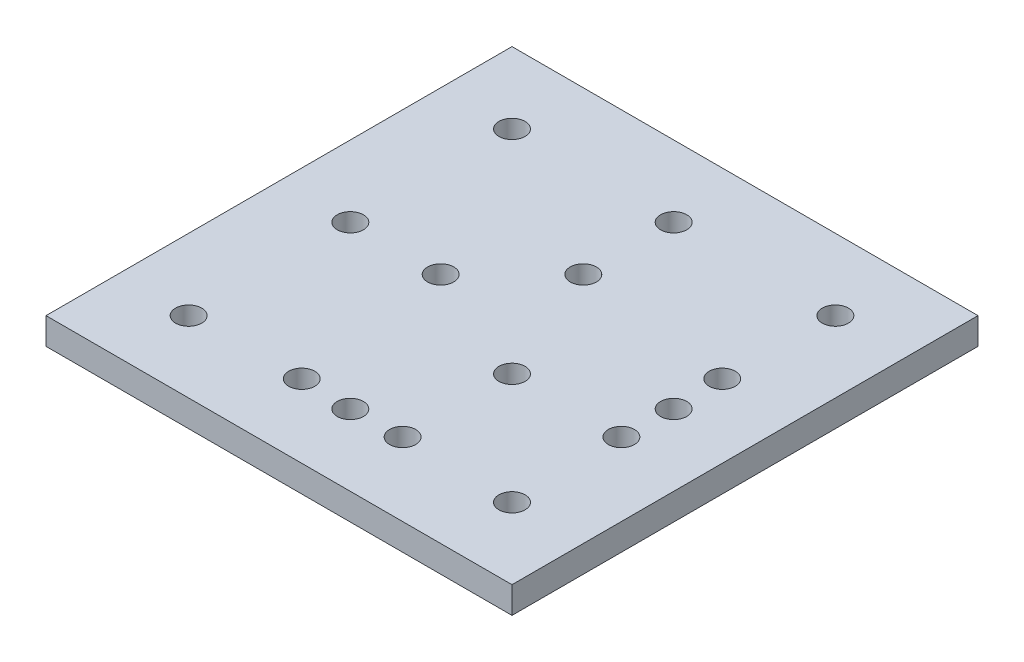
ISO-10303-21;
HEADER;
FILE_DESCRIPTION(('STEP AP214'),'2;1');
FILE_NAME('part.step','',(''),(''),'','','');
FILE_SCHEMA(('AUTOMOTIVE_DESIGN { 1 0 10303 214 1 1 1 1 }'));
ENDSEC;
DATA;
#1=APPLICATION_CONTEXT('core data for automotive mechanical design processes');
#2=APPLICATION_PROTOCOL_DEFINITION('international standard','automotive_design',2000,#1);
#3=PRODUCT_CONTEXT('',#1,'mechanical');
#4=PRODUCT('Part','Part','',(#3));
#5=PRODUCT_RELATED_PRODUCT_CATEGORY('part','',(#4));
#6=PRODUCT_DEFINITION_FORMATION('','',#4);
#7=PRODUCT_DEFINITION_CONTEXT('part definition',#1,'design');
#8=PRODUCT_DEFINITION('design','',#6,#7);
#9=PRODUCT_DEFINITION_SHAPE('','',#8);
#10=(LENGTH_UNIT() NAMED_UNIT(*) SI_UNIT(.MILLI.,.METRE.));
#11=(NAMED_UNIT(*) PLANE_ANGLE_UNIT() SI_UNIT($,.RADIAN.));
#12=(NAMED_UNIT(*) SI_UNIT($,.STERADIAN.) SOLID_ANGLE_UNIT());
#13=UNCERTAINTY_MEASURE_WITH_UNIT(LENGTH_MEASURE(1.E-05),#10,'distance_accuracy_value','');
#14=(GEOMETRIC_REPRESENTATION_CONTEXT(3) GLOBAL_UNCERTAINTY_ASSIGNED_CONTEXT((#13)) GLOBAL_UNIT_ASSIGNED_CONTEXT((#10,
#11,#12)) REPRESENTATION_CONTEXT('',''));
#15=CARTESIAN_POINT('',(0.,0.,0.));
#16=DIRECTION('',(0.,0.,1.));
#17=DIRECTION('',(1.,0.,0.));
#18=AXIS2_PLACEMENT_3D('',#15,#16,#17);
#19=CARTESIAN_POINT('',(0.,11.2,0.));
#20=DIRECTION('',(0.,1.,0.));
#21=DIRECTION('',(0.,0.,1.));
#22=AXIS2_PLACEMENT_3D('',#19,#20,#21);
#23=PLANE('',#22);
#24=CARTESIAN_POINT('',(82.6066017177982,11.2,-59.6066017177982));
#25=DIRECTION('',(0.,1.,0.));
#26=DIRECTION('',(0.,0.,1.));
#27=AXIS2_PLACEMENT_3D('',#24,#25,#26);
#28=CIRCLE('',#27,2.75000000000001);
#29=CARTESIAN_POINT('',(82.6066017177982,11.2,-56.8566017177982));
#30=VERTEX_POINT('',#29);
#31=EDGE_CURVE('E195',#30,#30,#28,.T.);
#32=ORIENTED_EDGE('',*,*,#31,.F.);
#33=EDGE_LOOP('',(#32));
#34=FACE_BOUND('',#33,.T.);
#35=CARTESIAN_POINT('',(82.6066017177982,11.2,-38.3933982822018));
#36=DIRECTION('',(0.,1.,0.));
#37=DIRECTION('',(0.,0.,1.));
#38=AXIS2_PLACEMENT_3D('',#35,#36,#37);
#39=CIRCLE('',#38,2.75000000000001);
#40=CARTESIAN_POINT('',(82.6066017177982,11.2,-35.6433982822018));
#41=VERTEX_POINT('',#40);
#42=EDGE_CURVE('E189',#41,#41,#39,.T.);
#43=ORIENTED_EDGE('',*,*,#42,.F.);
#44=EDGE_LOOP('',(#43));
#45=FACE_BOUND('',#44,.T.);
#46=CARTESIAN_POINT('',(34.,11.2,-49.));
#47=DIRECTION('',(0.,1.,0.));
#48=DIRECTION('',(0.,0.,1.));
#49=AXIS2_PLACEMENT_3D('',#46,#47,#48);
#50=CIRCLE('',#49,2.75);
#51=CARTESIAN_POINT('',(34.,11.2,-46.25));
#52=VERTEX_POINT('',#51);
#53=EDGE_CURVE('E183',#52,#52,#50,.T.);
#54=ORIENTED_EDGE('',*,*,#53,.F.);
#55=EDGE_LOOP('',(#54));
#56=FACE_BOUND('',#55,.T.);
#57=CARTESIAN_POINT('',(38.3933982822018,11.2,-15.3933982822018));
#58=DIRECTION('',(0.,1.,0.));
#59=DIRECTION('',(0.,0.,1.));
#60=AXIS2_PLACEMENT_3D('',#57,#58,#59);
#61=CIRCLE('',#60,2.75);
#62=CARTESIAN_POINT('',(38.3933982822018,11.2,-12.6433982822018));
#63=VERTEX_POINT('',#62);
#64=EDGE_CURVE('E177',#63,#63,#61,.T.);
#65=ORIENTED_EDGE('',*,*,#64,.F.);
#66=EDGE_LOOP('',(#65));
#67=FACE_BOUND('',#66,.T.);
#68=CARTESIAN_POINT('',(59.6066017177982,11.2,-15.3933982822018));
#69=DIRECTION('',(0.,1.,0.));
#70=DIRECTION('',(0.,0.,1.));
#71=AXIS2_PLACEMENT_3D('',#68,#69,#70);
#72=CIRCLE('',#71,2.75);
#73=CARTESIAN_POINT('',(59.6066017177982,11.2,-12.6433982822018));
#74=VERTEX_POINT('',#73);
#75=EDGE_CURVE('E171',#74,#74,#72,.T.);
#76=ORIENTED_EDGE('',*,*,#75,.F.);
#77=EDGE_LOOP('',(#76));
#78=FACE_BOUND('',#77,.T.);
#79=CARTESIAN_POINT('',(59.6066017177982,11.2,-38.3933982822018));
#80=DIRECTION('',(0.,1.,0.));
#81=DIRECTION('',(0.,0.,1.));
#82=AXIS2_PLACEMENT_3D('',#79,#80,#81);
#83=CIRCLE('',#82,2.75);
#84=CARTESIAN_POINT('',(59.6066017177982,11.2,-35.6433982822018));
#85=VERTEX_POINT('',#84);
#86=EDGE_CURVE('E165',#85,#85,#83,.T.);
#87=ORIENTED_EDGE('',*,*,#86,.F.);
#88=EDGE_LOOP('',(#87));
#89=FACE_BOUND('',#88,.T.);
#90=CARTESIAN_POINT('',(49.,11.2,-64.));
#91=DIRECTION('',(0.,1.,0.));
#92=DIRECTION('',(0.,0.,1.));
#93=AXIS2_PLACEMENT_3D('',#90,#91,#92);
#94=CIRCLE('',#93,2.75);
#95=CARTESIAN_POINT('',(49.,11.2,-61.25));
#96=VERTEX_POINT('',#95);
#97=EDGE_CURVE('E159',#96,#96,#94,.T.);
#98=ORIENTED_EDGE('',*,*,#97,.F.);
#99=EDGE_LOOP('',(#98));
#100=FACE_BOUND('',#99,.T.);
#101=CARTESIAN_POINT('',(15.,11.2,-83.));
#102=DIRECTION('',(0.,1.,0.));
#103=DIRECTION('',(0.,0.,1.));
#104=AXIS2_PLACEMENT_3D('',#101,#102,#103);
#105=CIRCLE('',#104,2.75);
#106=CARTESIAN_POINT('',(15.,11.2,-80.25));
#107=VERTEX_POINT('',#106);
#108=EDGE_CURVE('E144',#107,#107,#105,.T.);
#109=ORIENTED_EDGE('',*,*,#108,.F.);
#110=EDGE_LOOP('',(#109));
#111=FACE_BOUND('',#110,.T.);
#112=CARTESIAN_POINT('',(83.,11.2,-83.));
#113=DIRECTION('',(0.,1.,0.));
#114=DIRECTION('',(0.,0.,1.));
#115=AXIS2_PLACEMENT_3D('',#112,#113,#114);
#116=CIRCLE('',#115,2.75000000000001);
#117=CARTESIAN_POINT('',(83.,11.2,-80.25));
#118=VERTEX_POINT('',#117);
#119=EDGE_CURVE('E132',#118,#118,#116,.T.);
#120=ORIENTED_EDGE('',*,*,#119,.F.);
#121=EDGE_LOOP('',(#120));
#122=FACE_BOUND('',#121,.T.);
#123=CARTESIAN_POINT('',(83.0000000000007,11.2,-15.));
#124=DIRECTION('',(0.,1.,0.));
#125=DIRECTION('',(0.,0.,1.));
#126=AXIS2_PLACEMENT_3D('',#123,#124,#125);
#127=CIRCLE('',#126,2.75000000000001);
#128=CARTESIAN_POINT('',(83.0000000000007,11.2,-12.25));
#129=VERTEX_POINT('',#128);
#130=EDGE_CURVE('E120',#129,#129,#127,.T.);
#131=ORIENTED_EDGE('',*,*,#130,.F.);
#132=EDGE_LOOP('',(#131));
#133=FACE_BOUND('',#132,.T.);
#134=CARTESIAN_POINT('',(15.0000000000007,11.2,-15.));
#135=DIRECTION('',(0.,1.,0.));
#136=DIRECTION('',(0.,0.,1.));
#137=AXIS2_PLACEMENT_3D('',#134,#135,#136);
#138=CIRCLE('',#137,2.75);
#139=CARTESIAN_POINT('',(15.0000000000007,11.2,-12.25));
#140=VERTEX_POINT('',#139);
#141=EDGE_CURVE('E99',#140,#140,#138,.T.);
#142=ORIENTED_EDGE('',*,*,#141,.F.);
#143=EDGE_LOOP('',(#142));
#144=FACE_BOUND('',#143,.T.);
#145=DIRECTION('',(-1.,0.,0.));
#146=VECTOR('',#145,1.);
#147=CARTESIAN_POINT('',(98.,11.2,-98.));
#148=LINE('',#147,#146);
#149=CARTESIAN_POINT('',(98.,11.2,-98.));
#150=VERTEX_POINT('',#149);
#151=CARTESIAN_POINT('',(0.,11.2,-98.));
#152=VERTEX_POINT('',#151);
#153=EDGE_CURVE('E84',#150,#152,#148,.T.);
#154=ORIENTED_EDGE('',*,*,#153,.T.);
#155=DIRECTION('',(0.,0.,1.));
#156=VECTOR('',#155,1.);
#157=CARTESIAN_POINT('',(0.,11.2,-98.));
#158=LINE('',#157,#156);
#159=CARTESIAN_POINT('',(0.,11.2,0.));
#160=VERTEX_POINT('',#159);
#161=EDGE_CURVE('E79',#152,#160,#158,.T.);
#162=ORIENTED_EDGE('',*,*,#161,.T.);
#163=DIRECTION('',(1.,0.,0.));
#164=VECTOR('',#163,1.);
#165=CARTESIAN_POINT('',(0.,11.2,0.));
#166=LINE('',#165,#164);
#167=CARTESIAN_POINT('',(98.,11.2,0.));
#168=VERTEX_POINT('',#167);
#169=EDGE_CURVE('E82',#160,#168,#166,.T.);
#170=ORIENTED_EDGE('',*,*,#169,.T.);
#171=DIRECTION('',(0.,0.,-1.));
#172=VECTOR('',#171,1.);
#173=CARTESIAN_POINT('',(98.,11.2,0.));
#174=LINE('',#173,#172);
#175=EDGE_CURVE('E49',#168,#150,#174,.T.);
#176=ORIENTED_EDGE('',*,*,#175,.T.);
#177=EDGE_LOOP('',(#154,#162,#170,#176));
#178=FACE_BOUND('',#177,.T.);
#179=CARTESIAN_POINT('',(49.0000000000007,11.2,-15.));
#180=DIRECTION('',(0.,1.,0.));
#181=DIRECTION('',(0.,0.,1.));
#182=AXIS2_PLACEMENT_3D('',#179,#180,#181);
#183=CIRCLE('',#182,2.75);
#184=CARTESIAN_POINT('',(49.0000000000007,11.2,-12.25));
#185=VERTEX_POINT('',#184);
#186=EDGE_CURVE('E114',#185,#185,#183,.T.);
#187=ORIENTED_EDGE('',*,*,#186,.F.);
#188=EDGE_LOOP('',(#187));
#189=FACE_BOUND('',#188,.T.);
#190=CARTESIAN_POINT('',(83.0000000000004,11.2,-49.));
#191=DIRECTION('',(0.,1.,0.));
#192=DIRECTION('',(0.,0.,1.));
#193=AXIS2_PLACEMENT_3D('',#190,#191,#192);
#194=CIRCLE('',#193,2.75000000000001);
#195=CARTESIAN_POINT('',(83.0000000000004,11.2,-46.25));
#196=VERTEX_POINT('',#195);
#197=EDGE_CURVE('E126',#196,#196,#194,.T.);
#198=ORIENTED_EDGE('',*,*,#197,.F.);
#199=EDGE_LOOP('',(#198));
#200=FACE_BOUND('',#199,.T.);
#201=CARTESIAN_POINT('',(49.,11.2,-83.));
#202=DIRECTION('',(0.,1.,0.));
#203=DIRECTION('',(0.,0.,1.));
#204=AXIS2_PLACEMENT_3D('',#201,#202,#203);
#205=CIRCLE('',#204,2.75);
#206=CARTESIAN_POINT('',(49.,11.2,-80.25));
#207=VERTEX_POINT('',#206);
#208=EDGE_CURVE('E138',#207,#207,#205,.T.);
#209=ORIENTED_EDGE('',*,*,#208,.F.);
#210=EDGE_LOOP('',(#209));
#211=FACE_BOUND('',#210,.T.);
#212=CARTESIAN_POINT('',(15.0000000000004,11.2,-49.));
#213=DIRECTION('',(0.,1.,0.));
#214=DIRECTION('',(0.,0.,1.));
#215=AXIS2_PLACEMENT_3D('',#212,#213,#214);
#216=CIRCLE('',#215,2.75);
#217=CARTESIAN_POINT('',(15.0000000000004,11.2,-46.25));
#218=VERTEX_POINT('',#217);
#219=EDGE_CURVE('E150',#218,#218,#216,.T.);
#220=ORIENTED_EDGE('',*,*,#219,.F.);
#221=EDGE_LOOP('',(#220));
#222=FACE_BOUND('',#221,.T.);
#223=ADVANCED_FACE('F32',(#34,#45,#56,#67,#78,#89,#100,#111,#122,#133,#144,#178,#189,#200,#211,
#222),#23,.T.);
#224=CARTESIAN_POINT('',(0.,5.6,0.));
#225=DIRECTION('',(0.,1.,0.));
#226=DIRECTION('',(0.,0.,1.));
#227=AXIS2_PLACEMENT_3D('',#224,#225,#226);
#228=PLANE('',#227);
#229=CARTESIAN_POINT('',(82.6066017177982,5.6,-59.6066017177982));
#230=DIRECTION('',(0.,1.,0.));
#231=DIRECTION('',(0.,0.,1.));
#232=AXIS2_PLACEMENT_3D('',#229,#230,#231);
#233=CIRCLE('',#232,2.75000000000001);
#234=CARTESIAN_POINT('',(82.6066017177982,5.6,-56.8566017177982));
#235=VERTEX_POINT('',#234);
#236=EDGE_CURVE('E192',#235,#235,#233,.T.);
#237=ORIENTED_EDGE('',*,*,#236,.T.);
#238=EDGE_LOOP('',(#237));
#239=FACE_BOUND('',#238,.T.);
#240=CARTESIAN_POINT('',(82.6066017177982,5.6,-38.3933982822018));
#241=DIRECTION('',(0.,1.,0.));
#242=DIRECTION('',(0.,0.,1.));
#243=AXIS2_PLACEMENT_3D('',#240,#241,#242);
#244=CIRCLE('',#243,2.75000000000001);
#245=CARTESIAN_POINT('',(82.6066017177982,5.6,-35.6433982822018));
#246=VERTEX_POINT('',#245);
#247=EDGE_CURVE('E186',#246,#246,#244,.T.);
#248=ORIENTED_EDGE('',*,*,#247,.T.);
#249=EDGE_LOOP('',(#248));
#250=FACE_BOUND('',#249,.T.);
#251=CARTESIAN_POINT('',(34.,5.6,-49.));
#252=DIRECTION('',(0.,1.,0.));
#253=DIRECTION('',(0.,0.,1.));
#254=AXIS2_PLACEMENT_3D('',#251,#252,#253);
#255=CIRCLE('',#254,2.75);
#256=CARTESIAN_POINT('',(34.,5.6,-46.25));
#257=VERTEX_POINT('',#256);
#258=EDGE_CURVE('E180',#257,#257,#255,.T.);
#259=ORIENTED_EDGE('',*,*,#258,.T.);
#260=EDGE_LOOP('',(#259));
#261=FACE_BOUND('',#260,.T.);
#262=CARTESIAN_POINT('',(38.3933982822018,5.6,-15.3933982822018));
#263=DIRECTION('',(0.,1.,0.));
#264=DIRECTION('',(0.,0.,1.));
#265=AXIS2_PLACEMENT_3D('',#262,#263,#264);
#266=CIRCLE('',#265,2.75);
#267=CARTESIAN_POINT('',(38.3933982822018,5.6,-12.6433982822018));
#268=VERTEX_POINT('',#267);
#269=EDGE_CURVE('E174',#268,#268,#266,.T.);
#270=ORIENTED_EDGE('',*,*,#269,.T.);
#271=EDGE_LOOP('',(#270));
#272=FACE_BOUND('',#271,.T.);
#273=CARTESIAN_POINT('',(59.6066017177982,5.6,-15.3933982822018));
#274=DIRECTION('',(0.,1.,0.));
#275=DIRECTION('',(0.,0.,1.));
#276=AXIS2_PLACEMENT_3D('',#273,#274,#275);
#277=CIRCLE('',#276,2.75);
#278=CARTESIAN_POINT('',(59.6066017177982,5.6,-12.6433982822018));
#279=VERTEX_POINT('',#278);
#280=EDGE_CURVE('E168',#279,#279,#277,.T.);
#281=ORIENTED_EDGE('',*,*,#280,.T.);
#282=EDGE_LOOP('',(#281));
#283=FACE_BOUND('',#282,.T.);
#284=CARTESIAN_POINT('',(59.6066017177982,5.6,-38.3933982822018));
#285=DIRECTION('',(0.,1.,0.));
#286=DIRECTION('',(0.,0.,1.));
#287=AXIS2_PLACEMENT_3D('',#284,#285,#286);
#288=CIRCLE('',#287,2.75);
#289=CARTESIAN_POINT('',(59.6066017177982,5.6,-35.6433982822018));
#290=VERTEX_POINT('',#289);
#291=EDGE_CURVE('E162',#290,#290,#288,.T.);
#292=ORIENTED_EDGE('',*,*,#291,.T.);
#293=EDGE_LOOP('',(#292));
#294=FACE_BOUND('',#293,.T.);
#295=CARTESIAN_POINT('',(49.,5.6,-64.));
#296=DIRECTION('',(0.,1.,0.));
#297=DIRECTION('',(0.,0.,1.));
#298=AXIS2_PLACEMENT_3D('',#295,#296,#297);
#299=CIRCLE('',#298,2.75);
#300=CARTESIAN_POINT('',(49.,5.6,-61.25));
#301=VERTEX_POINT('',#300);
#302=EDGE_CURVE('E156',#301,#301,#299,.T.);
#303=ORIENTED_EDGE('',*,*,#302,.T.);
#304=EDGE_LOOP('',(#303));
#305=FACE_BOUND('',#304,.T.);
#306=CARTESIAN_POINT('',(15.,5.6,-83.));
#307=DIRECTION('',(0.,1.,0.));
#308=DIRECTION('',(0.,0.,1.));
#309=AXIS2_PLACEMENT_3D('',#306,#307,#308);
#310=CIRCLE('',#309,2.75);
#311=CARTESIAN_POINT('',(15.,5.6,-80.25));
#312=VERTEX_POINT('',#311);
#313=EDGE_CURVE('E147',#312,#312,#310,.T.);
#314=ORIENTED_EDGE('',*,*,#313,.T.);
#315=EDGE_LOOP('',(#314));
#316=FACE_BOUND('',#315,.T.);
#317=CARTESIAN_POINT('',(83.,5.6,-83.));
#318=DIRECTION('',(0.,1.,0.));
#319=DIRECTION('',(0.,0.,1.));
#320=AXIS2_PLACEMENT_3D('',#317,#318,#319);
#321=CIRCLE('',#320,2.75000000000001);
#322=CARTESIAN_POINT('',(83.,5.6,-80.25));
#323=VERTEX_POINT('',#322);
#324=EDGE_CURVE('E135',#323,#323,#321,.T.);
#325=ORIENTED_EDGE('',*,*,#324,.T.);
#326=EDGE_LOOP('',(#325));
#327=FACE_BOUND('',#326,.T.);
#328=CARTESIAN_POINT('',(83.0000000000007,5.6,-15.));
#329=DIRECTION('',(0.,1.,0.));
#330=DIRECTION('',(0.,0.,1.));
#331=AXIS2_PLACEMENT_3D('',#328,#329,#330);
#332=CIRCLE('',#331,2.75000000000001);
#333=CARTESIAN_POINT('',(83.0000000000007,5.6,-12.25));
#334=VERTEX_POINT('',#333);
#335=EDGE_CURVE('E123',#334,#334,#332,.T.);
#336=ORIENTED_EDGE('',*,*,#335,.T.);
#337=EDGE_LOOP('',(#336));
#338=FACE_BOUND('',#337,.T.);
#339=CARTESIAN_POINT('',(15.0000000000007,5.6,-15.));
#340=DIRECTION('',(0.,1.,0.));
#341=DIRECTION('',(0.,0.,1.));
#342=AXIS2_PLACEMENT_3D('',#339,#340,#341);
#343=CIRCLE('',#342,2.75);
#344=CARTESIAN_POINT('',(15.0000000000007,5.6,-12.25));
#345=VERTEX_POINT('',#344);
#346=EDGE_CURVE('E111',#345,#345,#343,.T.);
#347=ORIENTED_EDGE('',*,*,#346,.T.);
#348=EDGE_LOOP('',(#347));
#349=FACE_BOUND('',#348,.T.);
#350=DIRECTION('',(-1.,0.,0.));
#351=VECTOR('',#350,1.);
#352=CARTESIAN_POINT('',(98.,5.6,-98.));
#353=LINE('',#352,#351);
#354=CARTESIAN_POINT('',(98.,5.6,-98.));
#355=VERTEX_POINT('',#354);
#356=CARTESIAN_POINT('',(0.,5.6,-98.));
#357=VERTEX_POINT('',#356);
#358=EDGE_CURVE('E96',#355,#357,#353,.T.);
#359=ORIENTED_EDGE('',*,*,#358,.F.);
#360=DIRECTION('',(0.,0.,-1.));
#361=VECTOR('',#360,1.);
#362=CARTESIAN_POINT('',(98.,5.6,0.));
#363=LINE('',#362,#361);
#364=CARTESIAN_POINT('',(98.,5.6,0.));
#365=VERTEX_POINT('',#364);
#366=EDGE_CURVE('E72',#365,#355,#363,.T.);
#367=ORIENTED_EDGE('',*,*,#366,.F.);
#368=DIRECTION('',(1.,0.,0.));
#369=VECTOR('',#368,1.);
#370=CARTESIAN_POINT('',(0.,5.6,0.));
#371=LINE('',#370,#369);
#372=CARTESIAN_POINT('',(0.,5.6,0.));
#373=VERTEX_POINT('',#372);
#374=EDGE_CURVE('E66',#373,#365,#371,.T.);
#375=ORIENTED_EDGE('',*,*,#374,.F.);
#376=DIRECTION('',(0.,0.,1.));
#377=VECTOR('',#376,1.);
#378=CARTESIAN_POINT('',(0.,5.6,-98.));
#379=LINE('',#378,#377);
#380=EDGE_CURVE('E88',#357,#373,#379,.T.);
#381=ORIENTED_EDGE('',*,*,#380,.F.);
#382=EDGE_LOOP('',(#359,#367,#375,#381));
#383=FACE_BOUND('',#382,.T.);
#384=CARTESIAN_POINT('',(49.0000000000007,5.6,-15.));
#385=DIRECTION('',(0.,1.,0.));
#386=DIRECTION('',(0.,0.,1.));
#387=AXIS2_PLACEMENT_3D('',#384,#385,#386);
#388=CIRCLE('',#387,2.75);
#389=CARTESIAN_POINT('',(49.0000000000007,5.6,-12.25));
#390=VERTEX_POINT('',#389);
#391=EDGE_CURVE('E117',#390,#390,#388,.T.);
#392=ORIENTED_EDGE('',*,*,#391,.T.);
#393=EDGE_LOOP('',(#392));
#394=FACE_BOUND('',#393,.T.);
#395=CARTESIAN_POINT('',(83.0000000000004,5.6,-49.));
#396=DIRECTION('',(0.,1.,0.));
#397=DIRECTION('',(0.,0.,1.));
#398=AXIS2_PLACEMENT_3D('',#395,#396,#397);
#399=CIRCLE('',#398,2.75000000000001);
#400=CARTESIAN_POINT('',(83.0000000000004,5.6,-46.25));
#401=VERTEX_POINT('',#400);
#402=EDGE_CURVE('E129',#401,#401,#399,.T.);
#403=ORIENTED_EDGE('',*,*,#402,.T.);
#404=EDGE_LOOP('',(#403));
#405=FACE_BOUND('',#404,.T.);
#406=CARTESIAN_POINT('',(49.,5.6,-83.));
#407=DIRECTION('',(0.,1.,0.));
#408=DIRECTION('',(0.,0.,1.));
#409=AXIS2_PLACEMENT_3D('',#406,#407,#408);
#410=CIRCLE('',#409,2.75);
#411=CARTESIAN_POINT('',(49.,5.6,-80.25));
#412=VERTEX_POINT('',#411);
#413=EDGE_CURVE('E141',#412,#412,#410,.T.);
#414=ORIENTED_EDGE('',*,*,#413,.T.);
#415=EDGE_LOOP('',(#414));
#416=FACE_BOUND('',#415,.T.);
#417=CARTESIAN_POINT('',(15.0000000000004,5.6,-49.));
#418=DIRECTION('',(0.,1.,0.));
#419=DIRECTION('',(0.,0.,1.));
#420=AXIS2_PLACEMENT_3D('',#417,#418,#419);
#421=CIRCLE('',#420,2.75);
#422=CARTESIAN_POINT('',(15.0000000000004,5.6,-46.25));
#423=VERTEX_POINT('',#422);
#424=EDGE_CURVE('E153',#423,#423,#421,.T.);
#425=ORIENTED_EDGE('',*,*,#424,.T.);
#426=EDGE_LOOP('',(#425));
#427=FACE_BOUND('',#426,.T.);
#428=ADVANCED_FACE('F107',(#239,#250,#261,#272,#283,#294,#305,#316,#327,#338,#349,#383,#394,
#405,#416,#427),#228,.F.);
#429=CARTESIAN_POINT('',(98.,11.2,-98.));
#430=DIRECTION('',(0.,0.,1.));
#431=DIRECTION('',(1.,0.,0.));
#432=AXIS2_PLACEMENT_3D('',#429,#430,#431);
#433=PLANE('',#432);
#434=ORIENTED_EDGE('',*,*,#358,.T.);
#435=DIRECTION('',(0.,-1.,0.));
#436=VECTOR('',#435,1.);
#437=CARTESIAN_POINT('',(0.,11.2,-98.));
#438=LINE('',#437,#436);
#439=EDGE_CURVE('E11',#152,#357,#438,.T.);
#440=ORIENTED_EDGE('',*,*,#439,.F.);
#441=ORIENTED_EDGE('',*,*,#153,.F.);
#442=DIRECTION('',(0.,-1.,0.));
#443=VECTOR('',#442,1.);
#444=CARTESIAN_POINT('',(98.,11.2,-98.));
#445=LINE('',#444,#443);
#446=EDGE_CURVE('E92',#150,#355,#445,.T.);
#447=ORIENTED_EDGE('',*,*,#446,.T.);
#448=EDGE_LOOP('',(#434,#440,#441,#447));
#449=FACE_BOUND('',#448,.T.);
#450=ADVANCED_FACE('F34',(#449),#433,.F.);
#451=CARTESIAN_POINT('',(0.,11.2,-98.));
#452=DIRECTION('',(1.,0.,0.));
#453=DIRECTION('',(0.,0.,-1.));
#454=AXIS2_PLACEMENT_3D('',#451,#452,#453);
#455=PLANE('',#454);
#456=ORIENTED_EDGE('',*,*,#380,.T.);
#457=DIRECTION('',(0.,-1.,0.));
#458=VECTOR('',#457,1.);
#459=CARTESIAN_POINT('',(0.,11.2,0.));
#460=LINE('',#459,#458);
#461=EDGE_CURVE('E41',#160,#373,#460,.T.);
#462=ORIENTED_EDGE('',*,*,#461,.F.);
#463=ORIENTED_EDGE('',*,*,#161,.F.);
#464=ORIENTED_EDGE('',*,*,#439,.T.);
#465=EDGE_LOOP('',(#456,#462,#463,#464));
#466=FACE_BOUND('',#465,.T.);
#467=ADVANCED_FACE('F87',(#466),#455,.F.);
#468=CARTESIAN_POINT('',(0.,11.2,0.));
#469=DIRECTION('',(0.,0.,-1.));
#470=DIRECTION('',(-1.,0.,0.));
#471=AXIS2_PLACEMENT_3D('',#468,#469,#470);
#472=PLANE('',#471);
#473=ORIENTED_EDGE('',*,*,#374,.T.);
#474=DIRECTION('',(0.,-1.,0.));
#475=VECTOR('',#474,1.);
#476=CARTESIAN_POINT('',(98.,11.2,0.));
#477=LINE('',#476,#475);
#478=EDGE_CURVE('E89',#168,#365,#477,.T.);
#479=ORIENTED_EDGE('',*,*,#478,.F.);
#480=ORIENTED_EDGE('',*,*,#169,.F.);
#481=ORIENTED_EDGE('',*,*,#461,.T.);
#482=EDGE_LOOP('',(#473,#479,#480,#481));
#483=FACE_BOUND('',#482,.T.);
#484=ADVANCED_FACE('F90',(#483),#472,.F.);
#485=CARTESIAN_POINT('',(98.,11.2,0.));
#486=DIRECTION('',(-1.,0.,0.));
#487=DIRECTION('',(0.,0.,1.));
#488=AXIS2_PLACEMENT_3D('',#485,#486,#487);
#489=PLANE('',#488);
#490=ORIENTED_EDGE('',*,*,#366,.T.);
#491=ORIENTED_EDGE('',*,*,#446,.F.);
#492=ORIENTED_EDGE('',*,*,#175,.F.);
#493=ORIENTED_EDGE('',*,*,#478,.T.);
#494=EDGE_LOOP('',(#490,#491,#492,#493));
#495=FACE_BOUND('',#494,.T.);
#496=ADVANCED_FACE('F104',(#495),#489,.F.);
#497=CARTESIAN_POINT('',(15.0000000000007,11.2,-15.));
#498=DIRECTION('',(0.,-1.,0.));
#499=DIRECTION('',(0.,0.,-1.));
#500=AXIS2_PLACEMENT_3D('',#497,#498,#499);
#501=CYLINDRICAL_SURFACE('',#500,2.75);
#502=ORIENTED_EDGE('',*,*,#141,.T.);
#503=EDGE_LOOP('',(#502));
#504=FACE_BOUND('',#503,.T.);
#505=ORIENTED_EDGE('',*,*,#346,.F.);
#506=EDGE_LOOP('',(#505));
#507=FACE_BOUND('',#506,.T.);
#508=ADVANCED_FACE('F233',(#504,#507),#501,.F.);
#509=CARTESIAN_POINT('',(49.0000000000007,11.2,-15.));
#510=DIRECTION('',(0.,-1.,0.));
#511=DIRECTION('',(0.,0.,-1.));
#512=AXIS2_PLACEMENT_3D('',#509,#510,#511);
#513=CYLINDRICAL_SURFACE('',#512,2.75);
#514=ORIENTED_EDGE('',*,*,#186,.T.);
#515=EDGE_LOOP('',(#514));
#516=FACE_BOUND('',#515,.T.);
#517=ORIENTED_EDGE('',*,*,#391,.F.);
#518=EDGE_LOOP('',(#517));
#519=FACE_BOUND('',#518,.T.);
#520=ADVANCED_FACE('F236',(#516,#519),#513,.F.);
#521=CARTESIAN_POINT('',(83.0000000000007,11.2,-15.));
#522=DIRECTION('',(0.,-1.,0.));
#523=DIRECTION('',(0.,0.,-1.));
#524=AXIS2_PLACEMENT_3D('',#521,#522,#523);
#525=CYLINDRICAL_SURFACE('',#524,2.75000000000001);
#526=ORIENTED_EDGE('',*,*,#130,.T.);
#527=EDGE_LOOP('',(#526));
#528=FACE_BOUND('',#527,.T.);
#529=ORIENTED_EDGE('',*,*,#335,.F.);
#530=EDGE_LOOP('',(#529));
#531=FACE_BOUND('',#530,.T.);
#532=ADVANCED_FACE('F276',(#528,#531),#525,.F.);
#533=CARTESIAN_POINT('',(83.0000000000004,11.2,-49.));
#534=DIRECTION('',(0.,-1.,0.));
#535=DIRECTION('',(0.,0.,-1.));
#536=AXIS2_PLACEMENT_3D('',#533,#534,#535);
#537=CYLINDRICAL_SURFACE('',#536,2.75000000000001);
#538=ORIENTED_EDGE('',*,*,#197,.T.);
#539=EDGE_LOOP('',(#538));
#540=FACE_BOUND('',#539,.T.);
#541=ORIENTED_EDGE('',*,*,#402,.F.);
#542=EDGE_LOOP('',(#541));
#543=FACE_BOUND('',#542,.T.);
#544=ADVANCED_FACE('F285',(#540,#543),#537,.F.);
#545=CARTESIAN_POINT('',(83.,11.2,-83.));
#546=DIRECTION('',(0.,-1.,0.));
#547=DIRECTION('',(0.,0.,-1.));
#548=AXIS2_PLACEMENT_3D('',#545,#546,#547);
#549=CYLINDRICAL_SURFACE('',#548,2.75000000000001);
#550=ORIENTED_EDGE('',*,*,#119,.T.);
#551=EDGE_LOOP('',(#550));
#552=FACE_BOUND('',#551,.T.);
#553=ORIENTED_EDGE('',*,*,#324,.F.);
#554=EDGE_LOOP('',(#553));
#555=FACE_BOUND('',#554,.T.);
#556=ADVANCED_FACE('F294',(#552,#555),#549,.F.);
#557=CARTESIAN_POINT('',(49.,11.2,-83.));
#558=DIRECTION('',(0.,-1.,0.));
#559=DIRECTION('',(0.,0.,-1.));
#560=AXIS2_PLACEMENT_3D('',#557,#558,#559);
#561=CYLINDRICAL_SURFACE('',#560,2.75);
#562=ORIENTED_EDGE('',*,*,#208,.T.);
#563=EDGE_LOOP('',(#562));
#564=FACE_BOUND('',#563,.T.);
#565=ORIENTED_EDGE('',*,*,#413,.F.);
#566=EDGE_LOOP('',(#565));
#567=FACE_BOUND('',#566,.T.);
#568=ADVANCED_FACE('F303',(#564,#567),#561,.F.);
#569=CARTESIAN_POINT('',(15.,11.2,-83.));
#570=DIRECTION('',(0.,-1.,0.));
#571=DIRECTION('',(0.,0.,-1.));
#572=AXIS2_PLACEMENT_3D('',#569,#570,#571);
#573=CYLINDRICAL_SURFACE('',#572,2.75);
#574=ORIENTED_EDGE('',*,*,#108,.T.);
#575=EDGE_LOOP('',(#574));
#576=FACE_BOUND('',#575,.T.);
#577=ORIENTED_EDGE('',*,*,#313,.F.);
#578=EDGE_LOOP('',(#577));
#579=FACE_BOUND('',#578,.T.);
#580=ADVANCED_FACE('F312',(#576,#579),#573,.F.);
#581=CARTESIAN_POINT('',(15.0000000000004,11.2,-49.));
#582=DIRECTION('',(0.,-1.,0.));
#583=DIRECTION('',(0.,0.,-1.));
#584=AXIS2_PLACEMENT_3D('',#581,#582,#583);
#585=CYLINDRICAL_SURFACE('',#584,2.75);
#586=ORIENTED_EDGE('',*,*,#219,.T.);
#587=EDGE_LOOP('',(#586));
#588=FACE_BOUND('',#587,.T.);
#589=ORIENTED_EDGE('',*,*,#424,.F.);
#590=EDGE_LOOP('',(#589));
#591=FACE_BOUND('',#590,.T.);
#592=ADVANCED_FACE('F321',(#588,#591),#585,.F.);
#593=CARTESIAN_POINT('',(49.,5.6,-64.));
#594=DIRECTION('',(0.,1.,0.));
#595=DIRECTION('',(0.,0.,1.));
#596=AXIS2_PLACEMENT_3D('',#593,#594,#595);
#597=CYLINDRICAL_SURFACE('',#596,2.75);
#598=ORIENTED_EDGE('',*,*,#302,.F.);
#599=EDGE_LOOP('',(#598));
#600=FACE_BOUND('',#599,.T.);
#601=ORIENTED_EDGE('',*,*,#97,.T.);
#602=EDGE_LOOP('',(#601));
#603=FACE_BOUND('',#602,.T.);
#604=ADVANCED_FACE('F330',(#600,#603),#597,.F.);
#605=CARTESIAN_POINT('',(59.6066017177982,5.6,-38.3933982822018));
#606=DIRECTION('',(0.,1.,0.));
#607=DIRECTION('',(0.,0.,1.));
#608=AXIS2_PLACEMENT_3D('',#605,#606,#607);
#609=CYLINDRICAL_SURFACE('',#608,2.75);
#610=ORIENTED_EDGE('',*,*,#291,.F.);
#611=EDGE_LOOP('',(#610));
#612=FACE_BOUND('',#611,.T.);
#613=ORIENTED_EDGE('',*,*,#86,.T.);
#614=EDGE_LOOP('',(#613));
#615=FACE_BOUND('',#614,.T.);
#616=ADVANCED_FACE('F339',(#612,#615),#609,.F.);
#617=CARTESIAN_POINT('',(59.6066017177982,5.6,-15.3933982822018));
#618=DIRECTION('',(0.,1.,0.));
#619=DIRECTION('',(0.,0.,1.));
#620=AXIS2_PLACEMENT_3D('',#617,#618,#619);
#621=CYLINDRICAL_SURFACE('',#620,2.75);
#622=ORIENTED_EDGE('',*,*,#280,.F.);
#623=EDGE_LOOP('',(#622));
#624=FACE_BOUND('',#623,.T.);
#625=ORIENTED_EDGE('',*,*,#75,.T.);
#626=EDGE_LOOP('',(#625));
#627=FACE_BOUND('',#626,.T.);
#628=ADVANCED_FACE('F348',(#624,#627),#621,.F.);
#629=CARTESIAN_POINT('',(38.3933982822018,5.6,-15.3933982822018));
#630=DIRECTION('',(0.,1.,0.));
#631=DIRECTION('',(0.,0.,1.));
#632=AXIS2_PLACEMENT_3D('',#629,#630,#631);
#633=CYLINDRICAL_SURFACE('',#632,2.75);
#634=ORIENTED_EDGE('',*,*,#269,.F.);
#635=EDGE_LOOP('',(#634));
#636=FACE_BOUND('',#635,.T.);
#637=ORIENTED_EDGE('',*,*,#64,.T.);
#638=EDGE_LOOP('',(#637));
#639=FACE_BOUND('',#638,.T.);
#640=ADVANCED_FACE('F357',(#636,#639),#633,.F.);
#641=CARTESIAN_POINT('',(34.,5.6,-49.));
#642=DIRECTION('',(0.,1.,0.));
#643=DIRECTION('',(0.,0.,1.));
#644=AXIS2_PLACEMENT_3D('',#641,#642,#643);
#645=CYLINDRICAL_SURFACE('',#644,2.75);
#646=ORIENTED_EDGE('',*,*,#258,.F.);
#647=EDGE_LOOP('',(#646));
#648=FACE_BOUND('',#647,.T.);
#649=ORIENTED_EDGE('',*,*,#53,.T.);
#650=EDGE_LOOP('',(#649));
#651=FACE_BOUND('',#650,.T.);
#652=ADVANCED_FACE('F366',(#648,#651),#645,.F.);
#653=CARTESIAN_POINT('',(82.6066017177982,5.6,-38.3933982822018));
#654=DIRECTION('',(0.,1.,0.));
#655=DIRECTION('',(0.,0.,1.));
#656=AXIS2_PLACEMENT_3D('',#653,#654,#655);
#657=CYLINDRICAL_SURFACE('',#656,2.75000000000001);
#658=ORIENTED_EDGE('',*,*,#247,.F.);
#659=EDGE_LOOP('',(#658));
#660=FACE_BOUND('',#659,.T.);
#661=ORIENTED_EDGE('',*,*,#42,.T.);
#662=EDGE_LOOP('',(#661));
#663=FACE_BOUND('',#662,.T.);
#664=ADVANCED_FACE('F206',(#660,#663),#657,.F.);
#665=CARTESIAN_POINT('',(82.6066017177982,5.6,-59.6066017177982));
#666=DIRECTION('',(0.,1.,0.));
#667=DIRECTION('',(0.,0.,1.));
#668=AXIS2_PLACEMENT_3D('',#665,#666,#667);
#669=CYLINDRICAL_SURFACE('',#668,2.75000000000001);
#670=ORIENTED_EDGE('',*,*,#236,.F.);
#671=EDGE_LOOP('',(#670));
#672=FACE_BOUND('',#671,.T.);
#673=ORIENTED_EDGE('',*,*,#31,.T.);
#674=EDGE_LOOP('',(#673));
#675=FACE_BOUND('',#674,.T.);
#676=ADVANCED_FACE('F203',(#672,#675),#669,.F.);
#677=CLOSED_SHELL('',(#223,#428,#450,#467,#484,#496,#508,#520,#532,#544,#556,#568,#580,#592,
#604,#616,#628,#640,#652,#664,#676));
#678=MANIFOLD_SOLID_BREP('B2',#677);
#679=ADVANCED_BREP_SHAPE_REPRESENTATION('',(#18,#678),#14);
#680=SHAPE_DEFINITION_REPRESENTATION(#9,#679);
ENDSEC;
END-ISO-10303-21;
